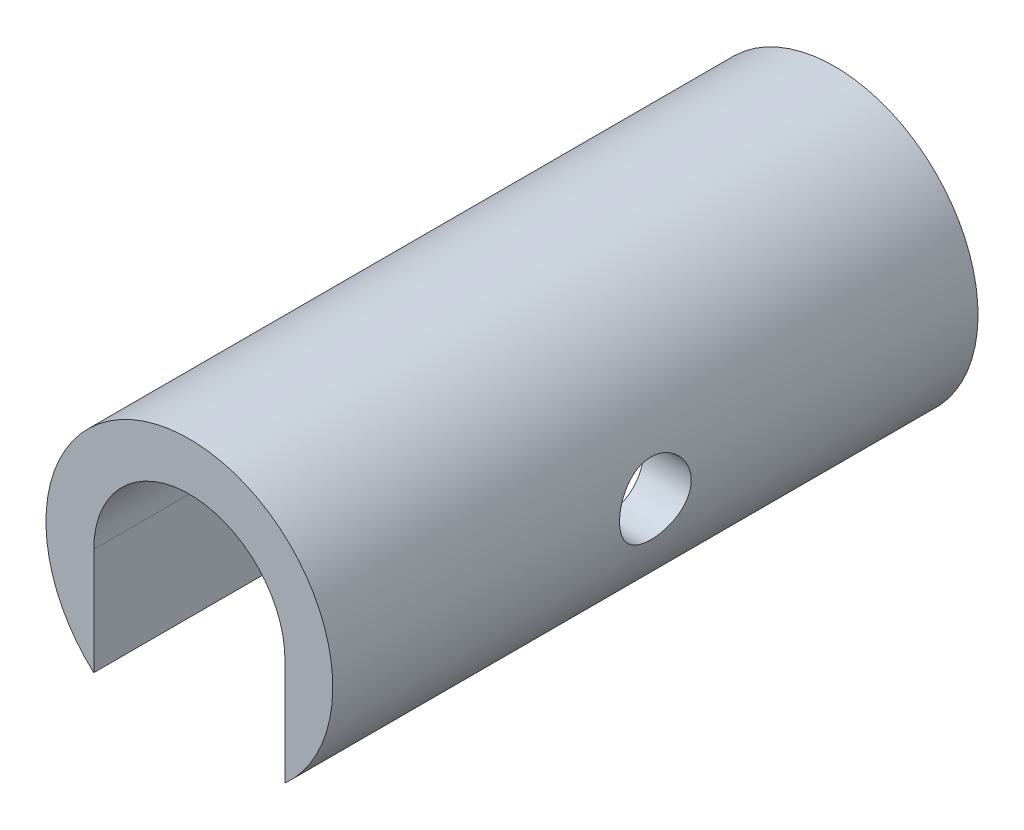
ISO-10303-21;
HEADER;
FILE_DESCRIPTION(('STEP AP214'),'2;1');
FILE_NAME('part.step','',(''),(''),'','','');
FILE_SCHEMA(('AUTOMOTIVE_DESIGN { 1 0 10303 214 1 1 1 1 }'));
ENDSEC;
DATA;
#1=APPLICATION_CONTEXT('core data for automotive mechanical design processes');
#2=APPLICATION_PROTOCOL_DEFINITION('international standard','automotive_design',2000,#1);
#3=PRODUCT_CONTEXT('',#1,'mechanical');
#4=PRODUCT('Part','Part','',(#3));
#5=PRODUCT_RELATED_PRODUCT_CATEGORY('part','',(#4));
#6=PRODUCT_DEFINITION_FORMATION('','',#4);
#7=PRODUCT_DEFINITION_CONTEXT('part definition',#1,'design');
#8=PRODUCT_DEFINITION('design','',#6,#7);
#9=PRODUCT_DEFINITION_SHAPE('','',#8);
#10=(LENGTH_UNIT() NAMED_UNIT(*) SI_UNIT(.MILLI.,.METRE.));
#11=(NAMED_UNIT(*) PLANE_ANGLE_UNIT() SI_UNIT($,.RADIAN.));
#12=(NAMED_UNIT(*) SI_UNIT($,.STERADIAN.) SOLID_ANGLE_UNIT());
#13=UNCERTAINTY_MEASURE_WITH_UNIT(LENGTH_MEASURE(1.E-05),#10,'distance_accuracy_value','');
#14=(GEOMETRIC_REPRESENTATION_CONTEXT(3) GLOBAL_UNCERTAINTY_ASSIGNED_CONTEXT((#13)) GLOBAL_UNIT_ASSIGNED_CONTEXT((#10,
#11,#12)) REPRESENTATION_CONTEXT('',''));
#15=CARTESIAN_POINT('',(0.,0.,0.));
#16=DIRECTION('',(0.,0.,1.));
#17=DIRECTION('',(1.,0.,0.));
#18=AXIS2_PLACEMENT_3D('',#15,#16,#17);
#19=CARTESIAN_POINT('',(4.,0.,27.));
#20=DIRECTION('',(1.,0.,0.));
#21=DIRECTION('',(0.,0.,-1.));
#22=AXIS2_PLACEMENT_3D('',#19,#20,#21);
#23=PLANE('',#22);
#24=DIRECTION('',(0.,0.,-1.));
#25=VECTOR('',#24,1.);
#26=CARTESIAN_POINT('',(4.,0.,27.));
#27=LINE('',#26,#25);
#28=CARTESIAN_POINT('',(4.,0.,27.));
#29=VERTEX_POINT('',#28);
#30=CARTESIAN_POINT('',(4.,0.,15.));
#31=VERTEX_POINT('',#30);
#32=EDGE_CURVE('E117',#29,#31,#27,.T.);
#33=ORIENTED_EDGE('',*,*,#32,.T.);
#34=CARTESIAN_POINT('',(4.,0.,13.5));
#35=DIRECTION('',(1.,0.,0.));
#36=DIRECTION('',(0.,0.,-1.));
#37=AXIS2_PLACEMENT_3D('',#34,#35,#36);
#38=CIRCLE('',#37,1.5);
#39=CARTESIAN_POINT('',(4.,0.,12.));
#40=VERTEX_POINT('',#39);
#41=EDGE_CURVE('E67',#31,#40,#38,.T.);
#42=ORIENTED_EDGE('',*,*,#41,.T.);
#43=CARTESIAN_POINT('',(4.,0.,0.));
#44=VERTEX_POINT('',#43);
#45=EDGE_CURVE('E168',#40,#44,#27,.T.);
#46=ORIENTED_EDGE('',*,*,#45,.T.);
#47=DIRECTION('',(0.,-1.,0.));
#48=VECTOR('',#47,1.);
#49=CARTESIAN_POINT('',(4.,0.,0.));
#50=LINE('',#49,#48);
#51=CARTESIAN_POINT('',(4.,-4.47213595499958,0.));
#52=VERTEX_POINT('',#51);
#53=EDGE_CURVE('E176',#44,#52,#50,.T.);
#54=ORIENTED_EDGE('',*,*,#53,.T.);
#55=DIRECTION('',(0.,0.,-1.));
#56=VECTOR('',#55,1.);
#57=CARTESIAN_POINT('',(4.,-4.47213595499958,27.));
#58=LINE('',#57,#56);
#59=CARTESIAN_POINT('',(4.,-4.47213595499958,27.));
#60=VERTEX_POINT('',#59);
#61=EDGE_CURVE('E99',#60,#52,#58,.T.);
#62=ORIENTED_EDGE('',*,*,#61,.F.);
#63=DIRECTION('',(0.,-1.,0.));
#64=VECTOR('',#63,1.);
#65=CARTESIAN_POINT('',(4.,0.,27.));
#66=LINE('',#65,#64);
#67=EDGE_CURVE('E166',#29,#60,#66,.T.);
#68=ORIENTED_EDGE('',*,*,#67,.F.);
#69=EDGE_LOOP('',(#33,#42,#46,#54,#62,#68));
#70=FACE_BOUND('',#69,.T.);
#71=ADVANCED_FACE('F41',(#70),#23,.F.);
#72=CARTESIAN_POINT('',(0.,0.,27.));
#73=DIRECTION('',(0.,0.,-1.));
#74=DIRECTION('',(-1.,0.,0.));
#75=AXIS2_PLACEMENT_3D('',#72,#73,#74);
#76=CYLINDRICAL_SURFACE('',#75,6.);
#77=CARTESIAN_POINT('',(-6.,0.,12.));
#78=CARTESIAN_POINT('',(-5.99999859868013,0.0828760886697311,12.0000023257382));
#79=CARTESIAN_POINT('',(-5.99826578131828,0.165778157830763,12.0068915507738));
#80=CARTESIAN_POINT('',(-5.99152113829892,0.329206323770533,12.034225151307));
#81=CARTESIAN_POINT('',(-5.98650745419969,0.409731046870739,12.0546772095378));
#82=CARTESIAN_POINT('',(-5.9737562633204,0.566020872182577,12.1084392534621));
#83=CARTESIAN_POINT('',(-5.96602202842087,0.641791563430003,12.1417337987153));
#84=CARTESIAN_POINT('',(-5.94865343807593,0.786672131904426,12.2201813900448));
#85=CARTESIAN_POINT('',(-5.9390190185405,0.855781784348759,12.2653348361189));
#86=CARTESIAN_POINT('',(-5.91867413591801,0.986801927300919,12.3672007896542));
#87=CARTESIAN_POINT('',(-5.90794707148533,1.04855569006107,12.4241115749592));
#88=CARTESIAN_POINT('',(-5.8867362011753,1.1617489272033,12.5474522049089));
#89=CARTESIAN_POINT('',(-5.87625242288349,1.21318723694913,12.6138831229465));
#90=CARTESIAN_POINT('',(-5.8565477569971,1.30502654279903,12.7555952267374));
#91=CARTESIAN_POINT('',(-5.84734794470605,1.34525221592536,12.8309932308104));
#92=CARTESIAN_POINT('',(-5.83149494812223,1.41239690855053,12.9877484116584));
#93=CARTESIAN_POINT('',(-5.82484135672789,1.43931805543933,13.0691046333258));
#94=CARTESIAN_POINT('',(-5.81500476717551,1.47855483680429,13.2337434982025));
#95=CARTESIAN_POINT('',(-5.81175491075426,1.49115226833334,13.3169548960498));
#96=CARTESIAN_POINT('',(-5.80889362537741,1.50226177506785,13.484368569014));
#97=CARTESIAN_POINT('',(-5.80928160448644,1.50077614181798,13.5685706806986));
#98=CARTESIAN_POINT('',(-5.81359205496618,1.48398652463928,13.7334158077445));
#99=CARTESIAN_POINT('',(-5.81742863001879,1.46901834019052,13.8140956214651));
#100=CARTESIAN_POINT('',(-5.82806709676484,1.42622418690311,13.9717610509113));
#101=CARTESIAN_POINT('',(-5.83486919970697,1.39839730206942,14.048746403029));
#102=CARTESIAN_POINT('',(-5.85075113904187,1.33038947793715,14.1977380162521));
#103=CARTESIAN_POINT('',(-5.85985327469421,1.29008666723291,14.2696861717896));
#104=CARTESIAN_POINT('',(-5.87929710846386,1.19835627601495,14.4059187097568));
#105=CARTESIAN_POINT('',(-5.88963902334735,1.14692674880884,14.4702017480673));
#106=CARTESIAN_POINT('',(-5.91075880539781,1.03266342468122,14.5912036156944));
#107=CARTESIAN_POINT('',(-5.92154069477972,0.969546258165859,14.6476544900613));
#108=CARTESIAN_POINT('',(-5.94205965578786,0.8346119175037,14.7492212424639));
#109=CARTESIAN_POINT('',(-5.95179669549415,0.762794477707945,14.7943367742636));
#110=CARTESIAN_POINT('',(-5.96917732094183,0.612115888681393,14.8720505862244));
#111=CARTESIAN_POINT('',(-5.97681360127725,0.533231393208624,14.9046053402544));
#112=CARTESIAN_POINT('',(-5.98907916991419,0.370876008142883,14.9559173057096));
#113=CARTESIAN_POINT('',(-5.99370903339281,0.287405999150484,14.9746771564181));
#114=CARTESIAN_POINT('',(-5.99935499271375,0.120539970390026,14.9974575655588));
#115=CARTESIAN_POINT('',(-6.00046053508279,0.0371967199882094,15.0018430260753));
#116=CARTESIAN_POINT('',(-5.99918804814451,-0.129032874801508,14.9967509979445));
#117=CARTESIAN_POINT('',(-5.99681033241847,-0.211919259644595,14.9872747572009));
#118=CARTESIAN_POINT('',(-5.98889581127357,-0.373614268776492,14.9550290916086));
#119=CARTESIAN_POINT('',(-5.98340634185811,-0.452465118968755,14.932458736523));
#120=CARTESIAN_POINT('',(-5.96988706634134,-0.605257292452512,14.8748929159716));
#121=CARTESIAN_POINT('',(-5.96185700369892,-0.679198119032635,14.8398961956868));
#122=CARTESIAN_POINT('',(-5.94393307926311,-0.821523134429848,14.7577638711253));
#123=CARTESIAN_POINT('',(-5.93400867366932,-0.889785441835831,14.7104238876032));
#124=CARTESIAN_POINT('',(-5.91344509187419,-1.01752661364325,14.605210091203));
#125=CARTESIAN_POINT('',(-5.90280579251705,-1.07700395897301,14.5473344603831));
#126=CARTESIAN_POINT('',(-5.88168956960771,-1.18699056807273,14.4209980391555));
#127=CARTESIAN_POINT('',(-5.87122304187281,-1.23724386762203,14.3523122969976));
#128=CARTESIAN_POINT('',(-5.85192878377239,-1.3255107590127,14.2072673655343));
#129=CARTESIAN_POINT('',(-5.84310098067026,-1.36352489415794,14.1309085170402));
#130=CARTESIAN_POINT('',(-5.82818094734665,-1.42595142060929,13.9730942775869));
#131=CARTESIAN_POINT('',(-5.82207255291906,-1.45044439665406,13.891672371656));
#132=CARTESIAN_POINT('',(-5.81326744090184,-1.48534565995378,13.7256903621109));
#133=CARTESIAN_POINT('',(-5.81056997719936,-1.49575702747866,13.6411309489675));
#134=CARTESIAN_POINT('',(-5.80894901203957,-1.50203859033399,13.4738789761448));
#135=CARTESIAN_POINT('',(-5.80991932728264,-1.49831789778012,13.3912025648753));
#136=CARTESIAN_POINT('',(-5.81527909007843,-1.47737727831287,13.227696111332));
#137=CARTESIAN_POINT('',(-5.81966846891857,-1.46015762268677,13.1468660319863));
#138=CARTESIAN_POINT('',(-5.83131260682723,-1.41293131944279,12.9897915409346));
#139=CARTESIAN_POINT('',(-5.8385501523631,-1.38300140468038,12.9135226947598));
#140=CARTESIAN_POINT('',(-5.85507755724829,-1.31126491360507,12.7670346172863));
#141=CARTESIAN_POINT('',(-5.86436770120773,-1.26945669003419,12.6968162268131));
#142=CARTESIAN_POINT('',(-5.88425634263512,-1.17386774863714,12.562445370998));
#143=CARTESIAN_POINT('',(-5.89488264831757,-1.11980316291225,12.498498926576));
#144=CARTESIAN_POINT('',(-5.91608027246286,-1.00178937118973,12.3804529552046));
#145=CARTESIAN_POINT('',(-5.9266515772706,-0.937837821261145,12.326355769887));
#146=CARTESIAN_POINT('',(-5.94677655647663,-0.800467586702589,12.2285886914354));
#147=CARTESIAN_POINT('',(-5.95630833365868,-0.726898422316385,12.1851253863284));
#148=CARTESIAN_POINT('',(-5.97304924975119,-0.573266059510475,12.1112525370595));
#149=CARTESIAN_POINT('',(-5.98026005199782,-0.49320756343674,12.0808336393515));
#150=CARTESIAN_POINT('',(-5.99048059565542,-0.344410253243472,12.0384281696703));
#151=CARTESIAN_POINT('',(-5.99402585052691,-0.276380170908069,12.0240487569466));
#152=CARTESIAN_POINT('',(-5.99878605231948,-0.138906071536283,12.0048340563781));
#153=CARTESIAN_POINT('',(-6.00000117450894,-0.0694621612426163,11.9999980506947));
#154=CARTESIAN_POINT('',(-6.,0.,12.));
#155=B_SPLINE_CURVE_WITH_KNOTS('',3,(#77,#78,#79,#80,#81,#82,#83,#84,#85,#86,#87,#88,#89,#90,
#91,#92,#93,#94,#95,#96,#97,#98,#99,#100,#101,#102,#103,#104,#105,#106,#107,#108,#109,#110,#111,
#112,#113,#114,#115,#116,#117,#118,#119,#120,#121,#122,#123,#124,#125,#126,#127,#128,#129,#130,
#131,#132,#133,#134,#135,#136,#137,#138,#139,#140,#141,#142,#143,#144,#145,#146,#147,#148,#149,
#150,#151,#152,#153,#154),.UNSPECIFIED.,.T.,.F.,(4,2,2,2,2,2,2,2,2,2,2,2,2,2,2,2,2,2,2,2,2,2,2,
2,2,2,2,2,2,2,2,2,2,2,2,2,2,2,4),(0.,0.24837371247189,0.496888237763899,0.745104902286106,
0.993329940169327,1.24614435437139,1.49898729580062,1.75558647545807,2.01214461169368,
2.2635629509943,2.51494038112697,2.76022497007018,3.00552703466038,3.25330527873879,
3.50112690836163,3.75601500969019,4.01091089558247,4.26668229009114,4.52240473688643,
4.77158308949276,5.02073901112743,5.26620274514037,5.5116912732229,5.76153587565352,
6.01142363008019,6.26744509204475,6.52345518749508,6.77792254614036,7.03233423252408,
7.27943780398612,7.52653640956034,7.77216400559447,8.01782568136901,8.2698957640991,
8.52202569770417,8.77872185499588,9.03523363821349,9.24342242942149,9.45159556043039),.UNSPECIFIED.);
#156=CARTESIAN_POINT('',(-6.,0.,12.));
#157=VERTEX_POINT('',#156);
#158=EDGE_CURVE('E144',#157,#157,#155,.T.);
#159=ORIENTED_EDGE('',*,*,#158,.T.);
#160=EDGE_LOOP('',(#159));
#161=FACE_BOUND('',#160,.T.);
#162=CARTESIAN_POINT('',(6.,0.,12.));
#163=CARTESIAN_POINT('',(5.99999859868013,-0.0828760886697311,12.0000023257382));
#164=CARTESIAN_POINT('',(5.99826578131828,-0.165778157830763,12.0068915507738));
#165=CARTESIAN_POINT('',(5.99152113829892,-0.329206323770533,12.034225151307));
#166=CARTESIAN_POINT('',(5.98650745419969,-0.409731046870739,12.0546772095378));
#167=CARTESIAN_POINT('',(5.9737562633204,-0.566020872182577,12.1084392534621));
#168=CARTESIAN_POINT('',(5.96602202842087,-0.641791563430003,12.1417337987153));
#169=CARTESIAN_POINT('',(5.94865343807593,-0.786672131904426,12.2201813900448));
#170=CARTESIAN_POINT('',(5.9390190185405,-0.855781784348759,12.2653348361189));
#171=CARTESIAN_POINT('',(5.91867413591801,-0.986801927300919,12.3672007896542));
#172=CARTESIAN_POINT('',(5.90794707148533,-1.04855569006107,12.4241115749592));
#173=CARTESIAN_POINT('',(5.8867362011753,-1.1617489272033,12.5474522049089));
#174=CARTESIAN_POINT('',(5.87625242288349,-1.21318723694913,12.6138831229465));
#175=CARTESIAN_POINT('',(5.8565477569971,-1.30502654279903,12.7555952267374));
#176=CARTESIAN_POINT('',(5.84734794470605,-1.34525221592536,12.8309932308104));
#177=CARTESIAN_POINT('',(5.83149494812223,-1.41239690855053,12.9877484116584));
#178=CARTESIAN_POINT('',(5.82484135672789,-1.43931805543933,13.0691046333258));
#179=CARTESIAN_POINT('',(5.81500476717551,-1.47855483680429,13.2337434982025));
#180=CARTESIAN_POINT('',(5.81175491075426,-1.49115226833334,13.3169548960498));
#181=CARTESIAN_POINT('',(5.80889362537741,-1.50226177506785,13.484368569014));
#182=CARTESIAN_POINT('',(5.80928160448644,-1.50077614181798,13.5685706806986));
#183=CARTESIAN_POINT('',(5.81359205496618,-1.48398652463928,13.7334158077445));
#184=CARTESIAN_POINT('',(5.81742863001879,-1.46901834019052,13.8140956214651));
#185=CARTESIAN_POINT('',(5.82806709676484,-1.42622418690311,13.9717610509113));
#186=CARTESIAN_POINT('',(5.83486919970697,-1.39839730206942,14.048746403029));
#187=CARTESIAN_POINT('',(5.85075113904187,-1.33038947793715,14.1977380162521));
#188=CARTESIAN_POINT('',(5.85985327469421,-1.29008666723291,14.2696861717896));
#189=CARTESIAN_POINT('',(5.87929710846386,-1.19835627601495,14.4059187097568));
#190=CARTESIAN_POINT('',(5.88963902334735,-1.14692674880884,14.4702017480673));
#191=CARTESIAN_POINT('',(5.91075880539781,-1.03266342468122,14.5912036156944));
#192=CARTESIAN_POINT('',(5.92154069477972,-0.969546258165859,14.6476544900613));
#193=CARTESIAN_POINT('',(5.94205965578786,-0.8346119175037,14.7492212424639));
#194=CARTESIAN_POINT('',(5.95179669549415,-0.762794477707945,14.7943367742636));
#195=CARTESIAN_POINT('',(5.96917732094183,-0.612115888681393,14.8720505862244));
#196=CARTESIAN_POINT('',(5.97681360127725,-0.533231393208624,14.9046053402544));
#197=CARTESIAN_POINT('',(5.98907916991419,-0.370876008142883,14.9559173057096));
#198=CARTESIAN_POINT('',(5.99370903339281,-0.287405999150484,14.9746771564181));
#199=CARTESIAN_POINT('',(5.99935499271375,-0.120539970390026,14.9974575655588));
#200=CARTESIAN_POINT('',(6.00046053508279,-0.0371967199882094,15.0018430260753));
#201=CARTESIAN_POINT('',(5.99918804814451,0.129032874801508,14.9967509979445));
#202=CARTESIAN_POINT('',(5.99681033241847,0.211919259644595,14.9872747572009));
#203=CARTESIAN_POINT('',(5.98889581127357,0.373614268776492,14.9550290916086));
#204=CARTESIAN_POINT('',(5.98340634185811,0.452465118968755,14.932458736523));
#205=CARTESIAN_POINT('',(5.96988706634134,0.605257292452512,14.8748929159716));
#206=CARTESIAN_POINT('',(5.96185700369892,0.679198119032635,14.8398961956868));
#207=CARTESIAN_POINT('',(5.94393307926311,0.821523134429848,14.7577638711253));
#208=CARTESIAN_POINT('',(5.93400867366932,0.889785441835831,14.7104238876032));
#209=CARTESIAN_POINT('',(5.91344509187419,1.01752661364325,14.605210091203));
#210=CARTESIAN_POINT('',(5.90280579251705,1.07700395897301,14.5473344603831));
#211=CARTESIAN_POINT('',(5.88168956960771,1.18699056807273,14.4209980391555));
#212=CARTESIAN_POINT('',(5.87122304187281,1.23724386762203,14.3523122969976));
#213=CARTESIAN_POINT('',(5.85192878377239,1.3255107590127,14.2072673655343));
#214=CARTESIAN_POINT('',(5.84310098067026,1.36352489415794,14.1309085170402));
#215=CARTESIAN_POINT('',(5.82818094734665,1.42595142060929,13.9730942775869));
#216=CARTESIAN_POINT('',(5.82207255291906,1.45044439665406,13.891672371656));
#217=CARTESIAN_POINT('',(5.81326744090184,1.48534565995378,13.7256903621109));
#218=CARTESIAN_POINT('',(5.81056997719936,1.49575702747866,13.6411309489675));
#219=CARTESIAN_POINT('',(5.80894901203957,1.50203859033399,13.4738789761448));
#220=CARTESIAN_POINT('',(5.80991932728264,1.49831789778012,13.3912025648753));
#221=CARTESIAN_POINT('',(5.81527909007843,1.47737727831287,13.227696111332));
#222=CARTESIAN_POINT('',(5.81966846891857,1.46015762268677,13.1468660319863));
#223=CARTESIAN_POINT('',(5.83131260682723,1.41293131944279,12.9897915409346));
#224=CARTESIAN_POINT('',(5.8385501523631,1.38300140468038,12.9135226947598));
#225=CARTESIAN_POINT('',(5.85507755724829,1.31126491360507,12.7670346172863));
#226=CARTESIAN_POINT('',(5.86436770120773,1.26945669003419,12.6968162268131));
#227=CARTESIAN_POINT('',(5.88425634263512,1.17386774863714,12.562445370998));
#228=CARTESIAN_POINT('',(5.89488264831757,1.11980316291225,12.498498926576));
#229=CARTESIAN_POINT('',(5.91608027246286,1.00178937118973,12.3804529552046));
#230=CARTESIAN_POINT('',(5.9266515772706,0.937837821261145,12.326355769887));
#231=CARTESIAN_POINT('',(5.94677655647663,0.800467586702589,12.2285886914354));
#232=CARTESIAN_POINT('',(5.95630833365868,0.726898422316385,12.1851253863284));
#233=CARTESIAN_POINT('',(5.97304924975119,0.573266059510475,12.1112525370595));
#234=CARTESIAN_POINT('',(5.98026005199782,0.49320756343674,12.0808336393515));
#235=CARTESIAN_POINT('',(5.99048059565542,0.344410253243472,12.0384281696703));
#236=CARTESIAN_POINT('',(5.99402585052691,0.276380170908069,12.0240487569466));
#237=CARTESIAN_POINT('',(5.99878605231948,0.138906071536283,12.0048340563781));
#238=CARTESIAN_POINT('',(6.00000117450894,0.0694621612426163,11.9999980506947));
#239=CARTESIAN_POINT('',(6.,0.,12.));
#240=B_SPLINE_CURVE_WITH_KNOTS('',3,(#162,#163,#164,#165,#166,#167,#168,#169,#170,#171,#172,
#173,#174,#175,#176,#177,#178,#179,#180,#181,#182,#183,#184,#185,#186,#187,#188,#189,#190,#191,
#192,#193,#194,#195,#196,#197,#198,#199,#200,#201,#202,#203,#204,#205,#206,#207,#208,#209,#210,
#211,#212,#213,#214,#215,#216,#217,#218,#219,#220,#221,#222,#223,#224,#225,#226,#227,#228,#229,
#230,#231,#232,#233,#234,#235,#236,#237,#238,#239),.UNSPECIFIED.,.T.,.F.,(4,2,2,2,2,2,2,2,2,2,2,
2,2,2,2,2,2,2,2,2,2,2,2,2,2,2,2,2,2,2,2,2,2,2,2,2,2,2,4),(0.,0.24837371247189,0.496888237763899,
0.745104902286106,0.993329940169327,1.24614435437139,1.49898729580062,1.75558647545807,
2.01214461169368,2.2635629509943,2.51494038112697,2.76022497007018,3.00552703466038,
3.25330527873879,3.50112690836163,3.75601500969019,4.01091089558247,4.26668229009114,
4.52240473688643,4.77158308949276,5.02073901112743,5.26620274514037,5.5116912732229,
5.76153587565352,6.01142363008019,6.26744509204475,6.52345518749508,6.77792254614036,
7.03233423252408,7.27943780398612,7.52653640956034,7.77216400559447,8.01782568136901,
8.2698957640991,8.52202569770417,8.77872185499588,9.03523363821349,9.24342242942149,
9.45159556043039),.UNSPECIFIED.);
#241=CARTESIAN_POINT('',(6.,0.,12.));
#242=VERTEX_POINT('',#241);
#243=EDGE_CURVE('E136',#242,#242,#240,.T.);
#244=ORIENTED_EDGE('',*,*,#243,.T.);
#245=EDGE_LOOP('',(#244));
#246=FACE_BOUND('',#245,.T.);
#247=CARTESIAN_POINT('',(0.,0.,0.));
#248=DIRECTION('',(0.,0.,1.));
#249=DIRECTION('',(1.,0.,0.));
#250=AXIS2_PLACEMENT_3D('',#247,#248,#249);
#251=CIRCLE('',#250,6.);
#252=CARTESIAN_POINT('',(-4.,-4.47213595499958,0.));
#253=VERTEX_POINT('',#252);
#254=EDGE_CURVE('E182',#52,#253,#251,.T.);
#255=ORIENTED_EDGE('',*,*,#254,.T.);
#256=DIRECTION('',(0.,0.,-1.));
#257=VECTOR('',#256,1.);
#258=CARTESIAN_POINT('',(-4.,-4.47213595499958,27.));
#259=LINE('',#258,#257);
#260=CARTESIAN_POINT('',(-4.,-4.47213595499958,27.));
#261=VERTEX_POINT('',#260);
#262=EDGE_CURVE('E114',#261,#253,#259,.T.);
#263=ORIENTED_EDGE('',*,*,#262,.F.);
#264=CARTESIAN_POINT('',(0.,0.,27.));
#265=DIRECTION('',(0.,0.,1.));
#266=DIRECTION('',(1.,0.,0.));
#267=AXIS2_PLACEMENT_3D('',#264,#265,#266);
#268=CIRCLE('',#267,6.);
#269=EDGE_CURVE('E173',#60,#261,#268,.T.);
#270=ORIENTED_EDGE('',*,*,#269,.F.);
#271=ORIENTED_EDGE('',*,*,#61,.T.);
#272=EDGE_LOOP('',(#255,#263,#270,#271));
#273=FACE_BOUND('',#272,.T.);
#274=ADVANCED_FACE('F147',(#161,#246,#273),#76,.T.);
#275=CARTESIAN_POINT('',(-4.,0.,27.));
#276=DIRECTION('',(1.,0.,0.));
#277=DIRECTION('',(0.,0.,-1.));
#278=AXIS2_PLACEMENT_3D('',#275,#276,#277);
#279=PLANE('',#278);
#280=CARTESIAN_POINT('',(-4.,0.,13.5));
#281=DIRECTION('',(1.,0.,0.));
#282=DIRECTION('',(0.,0.,-1.));
#283=AXIS2_PLACEMENT_3D('',#280,#281,#282);
#284=CIRCLE('',#283,1.5);
#285=CARTESIAN_POINT('',(-4.,0.,15.));
#286=VERTEX_POINT('',#285);
#287=CARTESIAN_POINT('',(-4.,0.,12.));
#288=VERTEX_POINT('',#287);
#289=EDGE_CURVE('E58',#286,#288,#284,.T.);
#290=ORIENTED_EDGE('',*,*,#289,.F.);
#291=DIRECTION('',(0.,0.,-1.));
#292=VECTOR('',#291,1.);
#293=CARTESIAN_POINT('',(-4.,0.,27.));
#294=LINE('',#293,#292);
#295=CARTESIAN_POINT('',(-4.,0.,27.));
#296=VERTEX_POINT('',#295);
#297=EDGE_CURVE('E102',#296,#286,#294,.T.);
#298=ORIENTED_EDGE('',*,*,#297,.F.);
#299=DIRECTION('',(0.,-1.,0.));
#300=VECTOR('',#299,1.);
#301=CARTESIAN_POINT('',(-4.,0.,27.));
#302=LINE('',#301,#300);
#303=EDGE_CURVE('E174',#296,#261,#302,.T.);
#304=ORIENTED_EDGE('',*,*,#303,.T.);
#305=ORIENTED_EDGE('',*,*,#262,.T.);
#306=DIRECTION('',(0.,-1.,0.));
#307=VECTOR('',#306,1.);
#308=CARTESIAN_POINT('',(-4.,0.,0.));
#309=LINE('',#308,#307);
#310=CARTESIAN_POINT('',(-4.,0.,0.));
#311=VERTEX_POINT('',#310);
#312=EDGE_CURVE('E184',#311,#253,#309,.T.);
#313=ORIENTED_EDGE('',*,*,#312,.F.);
#314=EDGE_CURVE('E110',#288,#311,#294,.T.);
#315=ORIENTED_EDGE('',*,*,#314,.F.);
#316=EDGE_LOOP('',(#290,#298,#304,#305,#313,#315));
#317=FACE_BOUND('',#316,.T.);
#318=ADVANCED_FACE('F105',(#317),#279,.T.);
#319=CARTESIAN_POINT('',(0.,0.,27.));
#320=DIRECTION('',(0.,0.,-1.));
#321=DIRECTION('',(-1.,0.,0.));
#322=AXIS2_PLACEMENT_3D('',#319,#320,#321);
#323=CYLINDRICAL_SURFACE('',#322,4.);
#324=CARTESIAN_POINT('',(4.,0.,15.));
#325=CARTESIAN_POINT('',(4.00000332562891,0.0406944283973197,15.000001228228));
#326=CARTESIAN_POINT('',(3.99937826077428,0.0813680861182135,14.9983428749656));
#327=CARTESIAN_POINT('',(3.99690697122683,0.162399201823215,14.9917369749816));
#328=CARTESIAN_POINT('',(3.99506107702692,0.202756742392984,14.9867903184408));
#329=CARTESIAN_POINT('',(3.98776471026783,0.322653174897334,14.9671145328018));
#330=CARTESIAN_POINT('',(3.98055497001428,0.401348400681007,14.9475490153742));
#331=CARTESIAN_POINT('',(3.96219000450238,0.554058449818505,14.8962508611244));
#332=CARTESIAN_POINT('',(3.95103699445089,0.628075873554348,14.8645250547362));
#333=CARTESIAN_POINT('',(3.92589288092106,0.769770959011274,14.7899097696715));
#334=CARTESIAN_POINT('',(3.91189996766051,0.837444537591145,14.747013167233));
#335=CARTESIAN_POINT('',(3.88186263685437,0.967346599491284,14.6493879473519));
#336=CARTESIAN_POINT('',(3.86576038743583,1.02926958467277,14.5942709573253));
#337=CARTESIAN_POINT('',(3.83360257178564,1.14324279320908,14.4745910413506));
#338=CARTESIAN_POINT('',(3.81754702259593,1.19528977206722,14.4100250234746));
#339=CARTESIAN_POINT('',(3.78662441591862,1.28998298069114,14.2702812148604));
#340=CARTESIAN_POINT('',(3.77182594346615,1.33219550604264,14.1947928470841));
#341=CARTESIAN_POINT('',(3.74599819464537,1.40318750743587,14.0371486191137));
#342=CARTESIAN_POINT('',(3.73496727532391,1.43197284081049,13.9549956845928));
#343=CARTESIAN_POINT('',(3.71854420720573,1.47408411229866,13.7898840532559));
#344=CARTESIAN_POINT('',(3.71293935239679,1.48799566181386,13.7070965864191));
#345=CARTESIAN_POINT('',(3.70738061490052,1.50179556476095,13.540185492249));
#346=CARTESIAN_POINT('',(3.70742450872697,1.50168943589491,13.4560624036867));
#347=CARTESIAN_POINT('',(3.71297513522078,1.4879042504185,13.2942299189369));
#348=CARTESIAN_POINT('',(3.71815476251536,1.47503790683102,13.216437992211));
#349=CARTESIAN_POINT('',(3.73284951493513,1.43744132424502,13.0642117946169));
#350=CARTESIAN_POINT('',(3.74236523175296,1.41270946608174,12.9897779835131));
#351=CARTESIAN_POINT('',(3.7648570030481,1.35163755391211,12.8447230558071));
#352=CARTESIAN_POINT('',(3.77789513634659,1.3150866725211,12.7742007534187));
#353=CARTESIAN_POINT('',(3.80594205213268,1.2315608289882,12.6400544669597));
#354=CARTESIAN_POINT('',(3.8209515207572,1.18458223346155,12.5764328988799));
#355=CARTESIAN_POINT('',(3.85247929788404,1.07782175128324,12.4534006103088));
#356=CARTESIAN_POINT('',(3.86903125341499,1.01739205795079,12.3945593252242));
#357=CARTESIAN_POINT('',(3.90091522123785,0.88732098651253,12.2876684215291));
#358=CARTESIAN_POINT('',(3.91624688152802,0.817676965789149,12.2396219095051));
#359=CARTESIAN_POINT('',(3.94427148828722,0.669687239861542,12.1550471034161));
#360=CARTESIAN_POINT('',(3.95691848504991,0.591220539542262,12.1187145887202));
#361=CARTESIAN_POINT('',(3.97779607854742,0.428732848852289,12.0599922402691));
#362=CARTESIAN_POINT('',(3.98603332255478,0.344720434087238,12.0375814127011));
#363=CARTESIAN_POINT('',(3.99436526412258,0.216558436440288,12.0150770083492));
#364=CARTESIAN_POINT('',(3.99647199369828,0.173445649042698,12.0094274530383));
#365=CARTESIAN_POINT('',(3.99929074883655,0.0868967349374137,12.0018902541076));
#366=CARTESIAN_POINT('',(4.00000434742606,0.0434610285634972,11.9999983675468));
#367=CARTESIAN_POINT('',(4.,0.,12.));
#368=B_SPLINE_CURVE_WITH_KNOTS('',3,(#324,#325,#326,#327,#328,#329,#330,#331,#332,#333,#334,
#335,#336,#337,#338,#339,#340,#341,#342,#343,#344,#345,#346,#347,#348,#349,#350,#351,#352,#353,
#354,#355,#356,#357,#358,#359,#360,#361,#362,#363,#364,#365,#366,#367),.UNSPECIFIED.,.F.,.F.,(4,
2,2,2,2,2,2,2,2,2,2,2,2,2,2,2,2,2,2,2,2,4),(0.,0.122004165629939,0.243975316802219,
0.486933389122465,0.729755191418079,0.972732225167152,1.22496219975096,1.47727489479742,
1.7392004007286,2.00101154001053,2.25208513778236,2.50305990712181,2.73901396321912,
2.97500022670228,3.21545253315063,3.45598875358111,3.7126732008052,3.96943142391607,
4.23028180536024,4.49073786512118,4.62117204894323,4.75145887014864),.UNSPECIFIED.);
#369=EDGE_CURVE('E11',#31,#40,#368,.T.);
#370=ORIENTED_EDGE('',*,*,#369,.F.);
#371=ORIENTED_EDGE('',*,*,#32,.F.);
#372=CARTESIAN_POINT('',(0.,0.,27.));
#373=DIRECTION('',(0.,0.,1.));
#374=DIRECTION('',(1.,0.,0.));
#375=AXIS2_PLACEMENT_3D('',#372,#373,#374);
#376=CIRCLE('',#375,4.);
#377=EDGE_CURVE('E115',#29,#296,#376,.T.);
#378=ORIENTED_EDGE('',*,*,#377,.T.);
#379=ORIENTED_EDGE('',*,*,#297,.T.);
#380=CARTESIAN_POINT('',(-4.,0.,12.));
#381=CARTESIAN_POINT('',(-4.00000332562891,0.0406944283973197,11.999998771772));
#382=CARTESIAN_POINT('',(-3.99937826077428,0.0813680861182134,12.0016571250344));
#383=CARTESIAN_POINT('',(-3.99690697122683,0.162399201823215,12.0082630250184));
#384=CARTESIAN_POINT('',(-3.99506107702692,0.202756742392984,12.0132096815592));
#385=CARTESIAN_POINT('',(-3.98776471026783,0.322653174897334,12.0328854671982));
#386=CARTESIAN_POINT('',(-3.98055497001428,0.401348400681007,12.0524509846258));
#387=CARTESIAN_POINT('',(-3.96219000450238,0.554058449818505,12.1037491388756));
#388=CARTESIAN_POINT('',(-3.95103699445089,0.628075873554347,12.1354749452638));
#389=CARTESIAN_POINT('',(-3.92589288092106,0.769770959011273,12.2100902303285));
#390=CARTESIAN_POINT('',(-3.91189996766051,0.837444537591145,12.252986832767));
#391=CARTESIAN_POINT('',(-3.88186263685437,0.967346599491284,12.3506120526481));
#392=CARTESIAN_POINT('',(-3.86576038743583,1.02926958467277,12.4057290426747));
#393=CARTESIAN_POINT('',(-3.83360257178564,1.14324279320908,12.5254089586494));
#394=CARTESIAN_POINT('',(-3.81754702259593,1.19528977206722,12.5899749765254));
#395=CARTESIAN_POINT('',(-3.78662441591862,1.28998298069114,12.7297187851396));
#396=CARTESIAN_POINT('',(-3.77182594346615,1.33219550604264,12.8052071529159));
#397=CARTESIAN_POINT('',(-3.74599819464537,1.40318750743587,12.9628513808863));
#398=CARTESIAN_POINT('',(-3.73496727532391,1.43197284081049,13.0450043154072));
#399=CARTESIAN_POINT('',(-3.71854420720573,1.47408411229866,13.2101159467441));
#400=CARTESIAN_POINT('',(-3.71293935239679,1.48799566181386,13.2929034135809));
#401=CARTESIAN_POINT('',(-3.70738061490052,1.50179556476095,13.459814507751));
#402=CARTESIAN_POINT('',(-3.70742450872697,1.50168943589491,13.5439375963133));
#403=CARTESIAN_POINT('',(-3.71297513522078,1.4879042504185,13.7057700810631));
#404=CARTESIAN_POINT('',(-3.71815476251536,1.47503790683102,13.783562007789));
#405=CARTESIAN_POINT('',(-3.73284951493513,1.43744132424502,13.9357882053831));
#406=CARTESIAN_POINT('',(-3.74236523175296,1.41270946608174,14.0102220164869));
#407=CARTESIAN_POINT('',(-3.7648570030481,1.35163755391211,14.1552769441929));
#408=CARTESIAN_POINT('',(-3.77789513634659,1.3150866725211,14.2257992465813));
#409=CARTESIAN_POINT('',(-3.80594205213268,1.2315608289882,14.3599455330403));
#410=CARTESIAN_POINT('',(-3.8209515207572,1.18458223346155,14.4235671011201));
#411=CARTESIAN_POINT('',(-3.85247929788404,1.07782175128324,14.5465993896912));
#412=CARTESIAN_POINT('',(-3.86903125341499,1.01739205795079,14.6054406747758));
#413=CARTESIAN_POINT('',(-3.90091522123785,0.88732098651253,14.7123315784709));
#414=CARTESIAN_POINT('',(-3.91624688152802,0.817676965789149,14.7603780904949));
#415=CARTESIAN_POINT('',(-3.94427148828722,0.669687239861542,14.8449528965839));
#416=CARTESIAN_POINT('',(-3.95691848504991,0.591220539542262,14.8812854112798));
#417=CARTESIAN_POINT('',(-3.97779607854742,0.428732848852289,14.9400077597309));
#418=CARTESIAN_POINT('',(-3.98603332255478,0.344720434087237,14.9624185872989));
#419=CARTESIAN_POINT('',(-3.99436526412258,0.216558436440288,14.9849229916508));
#420=CARTESIAN_POINT('',(-3.99647199369828,0.173445649042698,14.9905725469617));
#421=CARTESIAN_POINT('',(-3.99929074883655,0.0868967349374137,14.9981097458924));
#422=CARTESIAN_POINT('',(-4.00000434742606,0.0434610285634972,15.0000016324532));
#423=CARTESIAN_POINT('',(-4.,0.,15.));
#424=B_SPLINE_CURVE_WITH_KNOTS('',3,(#380,#381,#382,#383,#384,#385,#386,#387,#388,#389,#390,
#391,#392,#393,#394,#395,#396,#397,#398,#399,#400,#401,#402,#403,#404,#405,#406,#407,#408,#409,
#410,#411,#412,#413,#414,#415,#416,#417,#418,#419,#420,#421,#422,#423),.UNSPECIFIED.,.F.,.F.,(4,
2,2,2,2,2,2,2,2,2,2,2,2,2,2,2,2,2,2,2,2,4),(0.,0.122004165629939,0.243975316802219,
0.486933389122465,0.729755191418078,0.972732225167152,1.22496219975096,1.47727489479742,
1.7392004007286,2.00101154001053,2.25208513778236,2.50305990712181,2.73901396321912,
2.97500022670228,3.21545253315063,3.45598875358111,3.7126732008052,3.96943142391607,
4.23028180536024,4.49073786512118,4.62117204894323,4.75145887014864),.UNSPECIFIED.);
#425=EDGE_CURVE('E53',#288,#286,#424,.T.);
#426=ORIENTED_EDGE('',*,*,#425,.F.);
#427=ORIENTED_EDGE('',*,*,#314,.T.);
#428=CARTESIAN_POINT('',(0.,0.,0.));
#429=DIRECTION('',(0.,0.,1.));
#430=DIRECTION('',(1.,0.,0.));
#431=AXIS2_PLACEMENT_3D('',#428,#429,#430);
#432=CIRCLE('',#431,4.);
#433=EDGE_CURVE('E187',#44,#311,#432,.T.);
#434=ORIENTED_EDGE('',*,*,#433,.F.);
#435=ORIENTED_EDGE('',*,*,#45,.F.);
#436=EDGE_LOOP('',(#370,#371,#378,#379,#426,#427,#434,#435));
#437=FACE_BOUND('',#436,.T.);
#438=ADVANCED_FACE('F109',(#437),#323,.F.);
#439=CARTESIAN_POINT('',(0.,0.,27.));
#440=DIRECTION('',(0.,0.,1.));
#441=DIRECTION('',(1.,0.,0.));
#442=AXIS2_PLACEMENT_3D('',#439,#440,#441);
#443=PLANE('',#442);
#444=ORIENTED_EDGE('',*,*,#67,.T.);
#445=ORIENTED_EDGE('',*,*,#269,.T.);
#446=ORIENTED_EDGE('',*,*,#303,.F.);
#447=ORIENTED_EDGE('',*,*,#377,.F.);
#448=EDGE_LOOP('',(#444,#445,#446,#447));
#449=FACE_BOUND('',#448,.T.);
#450=ADVANCED_FACE('F134',(#449),#443,.T.);
#451=CARTESIAN_POINT('',(0.,0.,0.));
#452=DIRECTION('',(0.,0.,1.));
#453=DIRECTION('',(1.,0.,0.));
#454=AXIS2_PLACEMENT_3D('',#451,#452,#453);
#455=PLANE('',#454);
#456=ORIENTED_EDGE('',*,*,#53,.F.);
#457=ORIENTED_EDGE('',*,*,#433,.T.);
#458=ORIENTED_EDGE('',*,*,#312,.T.);
#459=ORIENTED_EDGE('',*,*,#254,.F.);
#460=EDGE_LOOP('',(#456,#457,#458,#459));
#461=FACE_BOUND('',#460,.T.);
#462=ADVANCED_FACE('F135',(#461),#455,.F.);
#463=CARTESIAN_POINT('',(-13.5,0.,13.5));
#464=DIRECTION('',(1.,0.,0.));
#465=DIRECTION('',(0.,0.,-1.));
#466=AXIS2_PLACEMENT_3D('',#463,#464,#465);
#467=CYLINDRICAL_SURFACE('',#466,1.5);
#468=ORIENTED_EDGE('',*,*,#289,.T.);
#469=ORIENTED_EDGE('',*,*,#425,.T.);
#470=EDGE_LOOP('',(#468,#469));
#471=FACE_BOUND('',#470,.T.);
#472=ORIENTED_EDGE('',*,*,#158,.F.);
#473=EDGE_LOOP('',(#472));
#474=FACE_BOUND('',#473,.T.);
#475=ADVANCED_FACE('F92',(#471,#474),#467,.F.);
#476=ORIENTED_EDGE('',*,*,#369,.T.);
#477=ORIENTED_EDGE('',*,*,#41,.F.);
#478=EDGE_LOOP('',(#476,#477));
#479=FACE_BOUND('',#478,.T.);
#480=ORIENTED_EDGE('',*,*,#243,.F.);
#481=EDGE_LOOP('',(#480));
#482=FACE_BOUND('',#481,.T.);
#483=ADVANCED_FACE('F132',(#479,#482),#467,.F.);
#484=CLOSED_SHELL('',(#71,#274,#318,#438,#450,#462,#475,#483));
#485=MANIFOLD_SOLID_BREP('B2',#484);
#486=ADVANCED_BREP_SHAPE_REPRESENTATION('',(#18,#485),#14);
#487=SHAPE_DEFINITION_REPRESENTATION(#9,#486);
ENDSEC;
END-ISO-10303-21;
